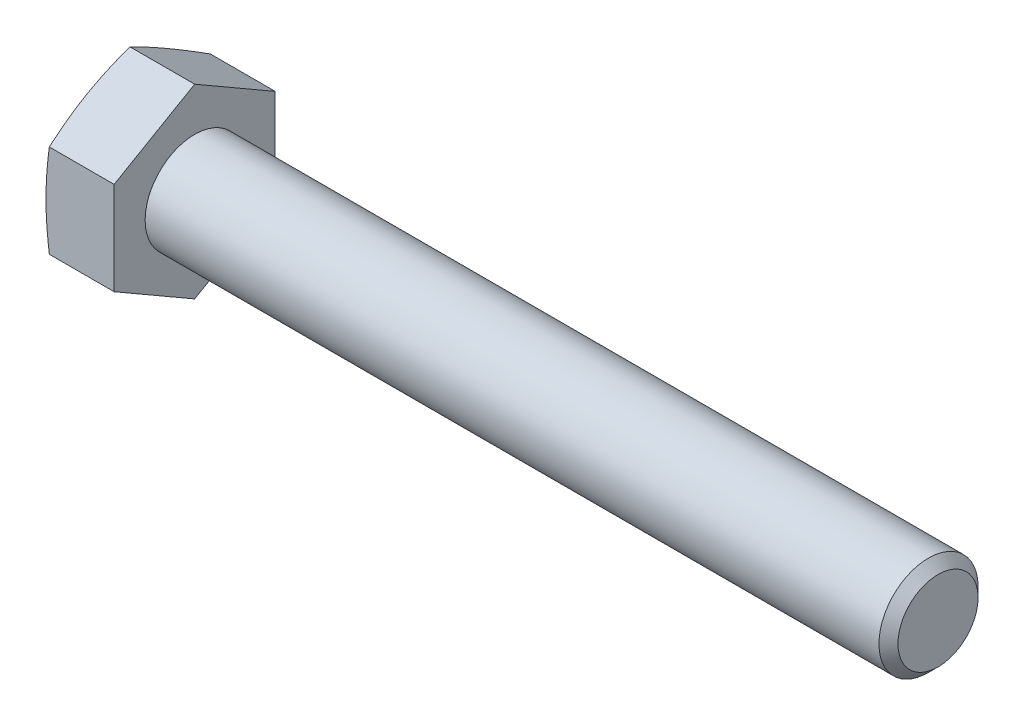
ISO-10303-21;
HEADER;
FILE_DESCRIPTION(('STEP AP214'),'2;1');
FILE_NAME('part.step','',(''),(''),'','','');
FILE_SCHEMA(('AUTOMOTIVE_DESIGN { 1 0 10303 214 1 1 1 1 }'));
ENDSEC;
DATA;
#1=APPLICATION_CONTEXT('core data for automotive mechanical design processes');
#2=APPLICATION_PROTOCOL_DEFINITION('international standard','automotive_design',2000,#1);
#3=PRODUCT_CONTEXT('',#1,'mechanical');
#4=PRODUCT('Part','Part','',(#3));
#5=PRODUCT_RELATED_PRODUCT_CATEGORY('part','',(#4));
#6=PRODUCT_DEFINITION_FORMATION('','',#4);
#7=PRODUCT_DEFINITION_CONTEXT('part definition',#1,'design');
#8=PRODUCT_DEFINITION('design','',#6,#7);
#9=PRODUCT_DEFINITION_SHAPE('','',#8);
#10=(LENGTH_UNIT() NAMED_UNIT(*) SI_UNIT(.MILLI.,.METRE.));
#11=(NAMED_UNIT(*) PLANE_ANGLE_UNIT() SI_UNIT($,.RADIAN.));
#12=(NAMED_UNIT(*) SI_UNIT($,.STERADIAN.) SOLID_ANGLE_UNIT());
#13=UNCERTAINTY_MEASURE_WITH_UNIT(LENGTH_MEASURE(1.E-05),#10,'distance_accuracy_value','');
#14=(GEOMETRIC_REPRESENTATION_CONTEXT(3) GLOBAL_UNCERTAINTY_ASSIGNED_CONTEXT((#13)) GLOBAL_UNIT_ASSIGNED_CONTEXT((#10,
#11,#12)) REPRESENTATION_CONTEXT('',''));
#15=CARTESIAN_POINT('',(0.,0.,0.));
#16=DIRECTION('',(0.,0.,1.));
#17=DIRECTION('',(1.,0.,0.));
#18=AXIS2_PLACEMENT_3D('',#15,#16,#17);
#19=CARTESIAN_POINT('',(-5.5,0.,0.));
#20=DIRECTION('',(1.,0.,0.));
#21=DIRECTION('',(0.,0.,-1.));
#22=AXIS2_PLACEMENT_3D('',#19,#20,#21);
#23=PLANE('',#22);
#24=CARTESIAN_POINT('',(-5.49999999998363,0.,0.));
#25=DIRECTION('',(1.,0.,0.));
#26=DIRECTION('',(0.,0.,-1.));
#27=AXIS2_PLACEMENT_3D('',#24,#25,#26);
#28=CIRCLE('',#27,6.50000000001683);
#29=CARTESIAN_POINT('',(-5.49999999998588,0.,-6.50000000000841));
#30=VERTEX_POINT('',#29);
#31=CARTESIAN_POINT('',(-5.49999999998588,5.62916512460615,-3.25000000000419));
#32=VERTEX_POINT('',#31);
#33=EDGE_CURVE('E92',#30,#32,#28,.T.);
#34=ORIENTED_EDGE('',*,*,#33,.F.);
#35=CARTESIAN_POINT('',(-5.49999999998363,0.,0.));
#36=DIRECTION('',(1.,0.,0.));
#37=DIRECTION('',(0.,0.,-1.));
#38=AXIS2_PLACEMENT_3D('',#35,#36,#37);
#39=CIRCLE('',#38,6.50000000001683);
#40=CARTESIAN_POINT('',(-5.49999999998588,-5.62916512460613,-3.25000000000421));
#41=VERTEX_POINT('',#40);
#42=EDGE_CURVE('E20',#41,#30,#39,.T.);
#43=ORIENTED_EDGE('',*,*,#42,.F.);
#44=CARTESIAN_POINT('',(-5.49999999998363,0.,0.));
#45=DIRECTION('',(1.,0.,0.));
#46=DIRECTION('',(0.,0.,-1.));
#47=AXIS2_PLACEMENT_3D('',#44,#45,#46);
#48=CIRCLE('',#47,6.50000000001683);
#49=CARTESIAN_POINT('',(-5.49999999998588,-5.62916512460613,3.25000000000421));
#50=VERTEX_POINT('',#49);
#51=EDGE_CURVE('E89',#50,#41,#48,.T.);
#52=ORIENTED_EDGE('',*,*,#51,.F.);
#53=CARTESIAN_POINT('',(-5.49999999998363,0.,0.));
#54=DIRECTION('',(1.,0.,0.));
#55=DIRECTION('',(0.,0.,-1.));
#56=AXIS2_PLACEMENT_3D('',#53,#54,#55);
#57=CIRCLE('',#56,6.50000000001683);
#58=CARTESIAN_POINT('',(-5.49999999998588,0.,6.50000000000841));
#59=VERTEX_POINT('',#58);
#60=EDGE_CURVE('E115',#59,#50,#57,.T.);
#61=ORIENTED_EDGE('',*,*,#60,.F.);
#62=CARTESIAN_POINT('',(-5.49999999998363,0.,0.));
#63=DIRECTION('',(1.,0.,0.));
#64=DIRECTION('',(0.,0.,-1.));
#65=AXIS2_PLACEMENT_3D('',#62,#63,#64);
#66=CIRCLE('',#65,6.50000000001683);
#67=CARTESIAN_POINT('',(-5.49999999998588,5.62916512460615,3.25000000000418));
#68=VERTEX_POINT('',#67);
#69=EDGE_CURVE('E355',#68,#59,#66,.T.);
#70=ORIENTED_EDGE('',*,*,#69,.F.);
#71=CARTESIAN_POINT('',(-5.49999999998363,0.,0.));
#72=DIRECTION('',(1.,0.,0.));
#73=DIRECTION('',(0.,0.,-1.));
#74=AXIS2_PLACEMENT_3D('',#71,#72,#73);
#75=CIRCLE('',#74,6.50000000001683);
#76=EDGE_CURVE('E358',#32,#68,#75,.T.);
#77=ORIENTED_EDGE('',*,*,#76,.F.);
#78=EDGE_LOOP('',(#34,#43,#52,#61,#70,#77));
#79=FACE_BOUND('',#78,.T.);
#80=ADVANCED_FACE('F17',(#79),#23,.F.);
#81=CARTESIAN_POINT('',(-5.22894612839764,0.,0.));
#82=DIRECTION('',(1.,0.,0.));
#83=DIRECTION('',(0.,0.,-1.));
#84=AXIS2_PLACEMENT_3D('',#81,#82,#83);
#85=CONICAL_SURFACE('',#84,7.51158682044206,1.30899693901504);
#86=CARTESIAN_POINT('',(-5.49999999998814,0.,-6.5));
#87=CARTESIAN_POINT('',(-5.50000713978379,-0.157002105596299,-6.5));
#88=CARTESIAN_POINT('',(-5.4984751302546,-0.313999789626533,-6.5));
#89=CARTESIAN_POINT('',(-5.49239322575447,-0.627931829436982,-6.5));
#90=CARTESIAN_POINT('',(-5.48784342787752,-0.784866187092113,-6.5));
#91=CARTESIAN_POINT('',(-5.46977187497293,-1.25514181892625,-6.5));
#92=CARTESIAN_POINT('',(-5.45182768773492,-1.56832203806163,-6.5));
#93=CARTESIAN_POINT('',(-5.40524314283542,-2.19378211713765,-6.5));
#94=CARTESIAN_POINT('',(-5.3766053075313,-2.50606217191358,-6.5));
#95=CARTESIAN_POINT('',(-5.31011748578564,-3.13000727514166,-6.5));
#96=CARTESIAN_POINT('',(-5.27225704270841,-3.44167121780765,-6.5));
#97=CARTESIAN_POINT('',(-5.2305627518808,-3.75277674973374,-6.5));
#98=B_SPLINE_CURVE_WITH_KNOTS('',3,(#86,#87,#88,#89,#90,#91,#92,#93,#94,#95,#96,#97),
.UNSPECIFIED.,.F.,.F.,(4,2,2,2,2,4),(0.,0.47099046628288,0.941965779704949,1.88281797607341,
2.82344838957416,3.76515029917301),.UNSPECIFIED.);
#99=CARTESIAN_POINT('',(-5.23056275188088,-3.75277674973315,-6.5));
#100=VERTEX_POINT('',#99);
#101=EDGE_CURVE('E100',#30,#100,#98,.T.);
#102=ORIENTED_EDGE('',*,*,#101,.T.);
#103=CARTESIAN_POINT('',(-5.2305627518808,-3.75277674973198,-6.50000000000102));
#104=CARTESIAN_POINT('',(-5.27225704270841,-3.90832951569502,-6.23057470609516));
#105=CARTESIAN_POINT('',(-5.31011748578564,-4.06416148702801,-5.96066581430279));
#106=CARTESIAN_POINT('',(-5.3766053075313,-4.37613403864205,-5.42031350434037));
#107=CARTESIAN_POINT('',(-5.40524314283542,-4.53227406603002,-5.14987104380922));
#108=CARTESIAN_POINT('',(-5.45182768773492,-4.84500410556803,-4.60820672627636));
#109=CARTESIAN_POINT('',(-5.46977187497293,-5.00159421513572,-4.33698470054235));
#110=CARTESIAN_POINT('',(-5.48784342787752,-5.23673203105279,-3.92971405659321));
#111=CARTESIAN_POINT('',(-5.49239322575447,-5.31519920988035,-3.79380491613727));
#112=CARTESIAN_POINT('',(-5.4984751302546,-5.47216522978558,-3.52193179459955));
#113=CARTESIAN_POINT('',(-5.50000713978379,-5.55066407180069,-3.38596781189405));
#114=CARTESIAN_POINT('',(-5.49999999998814,-5.62916512459884,-3.25000000000001));
#115=B_SPLINE_CURVE_WITH_KNOTS('',3,(#103,#104,#105,#106,#107,#108,#109,#110,#111,#112,#113,
#114),.UNSPECIFIED.,.F.,.F.,(4,2,2,2,2,4),(0.,0.941701909598858,1.8823323230996,
2.82318451946807,3.29415983289013,3.76515029917301),.UNSPECIFIED.);
#116=EDGE_CURVE('E98',#100,#41,#115,.T.);
#117=ORIENTED_EDGE('',*,*,#116,.T.);
#118=ORIENTED_EDGE('',*,*,#42,.T.);
#119=EDGE_LOOP('',(#102,#117,#118));
#120=FACE_BOUND('',#119,.T.);
#121=ADVANCED_FACE('F99',(#120),#85,.T.);
#122=CARTESIAN_POINT('',(-5.22894612839764,0.,0.));
#123=DIRECTION('',(1.,0.,0.));
#124=DIRECTION('',(0.,0.,-1.));
#125=AXIS2_PLACEMENT_3D('',#122,#123,#124);
#126=CONICAL_SURFACE('',#125,7.51158682044206,1.30899693901504);
#127=CARTESIAN_POINT('',(-5.49999999998814,-5.62916512459884,-3.25000000000001));
#128=CARTESIAN_POINT('',(-5.50000713978379,-5.70766617739699,-3.11403218810596));
#129=CARTESIAN_POINT('',(-5.4984751302546,-5.78616501941211,-2.97806820540046));
#130=CARTESIAN_POINT('',(-5.49239322575447,-5.94313103931734,-2.70619508386274));
#131=CARTESIAN_POINT('',(-5.48784342787752,-6.0215982181449,-2.5702859434068));
#132=CARTESIAN_POINT('',(-5.46977187497293,-6.25673603406197,-2.16301529945766));
#133=CARTESIAN_POINT('',(-5.45182768773492,-6.41332614362966,-1.89179327372364));
#134=CARTESIAN_POINT('',(-5.40524314283542,-6.72605618316767,-1.35012895619078));
#135=CARTESIAN_POINT('',(-5.3766053075313,-6.88219621055564,-1.07968649565962));
#136=CARTESIAN_POINT('',(-5.31011748578564,-7.19416876216969,-0.539334185697196));
#137=CARTESIAN_POINT('',(-5.27225704270841,-7.35000073350268,-0.269425293904831));
#138=CARTESIAN_POINT('',(-5.2305627518808,-7.50555349946573,1.03384319878969E-12));
#139=B_SPLINE_CURVE_WITH_KNOTS('',3,(#127,#128,#129,#130,#131,#132,#133,#134,#135,#136,#137,
#138),.UNSPECIFIED.,.F.,.F.,(4,2,2,2,2,4),(0.,0.470990466282884,0.941965779704958,
1.88281797607343,2.82344838957418,3.76515029917305),.UNSPECIFIED.);
#140=CARTESIAN_POINT('',(-5.23056275188088,-7.50555349946543,5.18363870005202E-13));
#141=VERTEX_POINT('',#140);
#142=EDGE_CURVE('E106',#41,#141,#139,.T.);
#143=ORIENTED_EDGE('',*,*,#142,.T.);
#144=CARTESIAN_POINT('',(-5.2305627518808,-7.50555349946571,-9.97501966197395E-13));
#145=CARTESIAN_POINT('',(-5.27225704270841,-7.35000073350267,0.269425293904866));
#146=CARTESIAN_POINT('',(-5.31011748578564,-7.19416876216968,0.539334185697226));
#147=CARTESIAN_POINT('',(-5.3766053075313,-6.88219621055564,1.07968649565964));
#148=CARTESIAN_POINT('',(-5.40524314283542,-6.72605618316767,1.3501289561908));
#149=CARTESIAN_POINT('',(-5.45182768773492,-6.41332614362966,1.89179327372365));
#150=CARTESIAN_POINT('',(-5.46977187497293,-6.25673603406197,2.16301529945767));
#151=CARTESIAN_POINT('',(-5.48784342787752,-6.02159821814491,2.57028594340681));
#152=CARTESIAN_POINT('',(-5.49239322575447,-5.94313103931734,2.70619508386274));
#153=CARTESIAN_POINT('',(-5.4984751302546,-5.78616501941212,2.97806820540046));
#154=CARTESIAN_POINT('',(-5.50000713978379,-5.707666177397,3.11403218810596));
#155=CARTESIAN_POINT('',(-5.49999999998814,-5.62916512459885,3.25));
#156=B_SPLINE_CURVE_WITH_KNOTS('',3,(#144,#145,#146,#147,#148,#149,#150,#151,#152,#153,#154,
#155),.UNSPECIFIED.,.F.,.F.,(4,2,2,2,2,4),(0.,0.941701909598855,1.88233232309959,
2.82318451946806,3.29415983289012,3.765150299173),.UNSPECIFIED.);
#157=EDGE_CURVE('E112',#141,#50,#156,.T.);
#158=ORIENTED_EDGE('',*,*,#157,.T.);
#159=ORIENTED_EDGE('',*,*,#51,.T.);
#160=EDGE_LOOP('',(#143,#158,#159));
#161=FACE_BOUND('',#160,.T.);
#162=ADVANCED_FACE('F109',(#161),#126,.T.);
#163=CARTESIAN_POINT('',(-5.22894612839764,0.,0.));
#164=DIRECTION('',(1.,0.,0.));
#165=DIRECTION('',(0.,0.,-1.));
#166=AXIS2_PLACEMENT_3D('',#163,#164,#165);
#167=CONICAL_SURFACE('',#166,7.51158682044206,1.30899693901504);
#168=CARTESIAN_POINT('',(-5.49999999998814,-5.62916512459885,3.25));
#169=CARTESIAN_POINT('',(-5.50000713978379,-5.5506640718007,3.38596781189405));
#170=CARTESIAN_POINT('',(-5.4984751302546,-5.47216522978558,3.52193179459955));
#171=CARTESIAN_POINT('',(-5.49239322575447,-5.31519920988036,3.79380491613727));
#172=CARTESIAN_POINT('',(-5.48784342787752,-5.23673203105279,3.92971405659321));
#173=CARTESIAN_POINT('',(-5.46977187497293,-5.00159421513572,4.33698470054235));
#174=CARTESIAN_POINT('',(-5.45182768773491,-4.84500410556803,4.60820672627637));
#175=CARTESIAN_POINT('',(-5.40524314283541,-4.53227406603002,5.14987104380922));
#176=CARTESIAN_POINT('',(-5.37660530753129,-4.37613403864205,5.42031350434038));
#177=CARTESIAN_POINT('',(-5.31011748578564,-4.06416148702801,5.9606658143028));
#178=CARTESIAN_POINT('',(-5.2722570427084,-3.90832951569502,6.23057470609517));
#179=CARTESIAN_POINT('',(-5.2305627518808,-3.75277674973198,6.50000000000103));
#180=B_SPLINE_CURVE_WITH_KNOTS('',3,(#168,#169,#170,#171,#172,#173,#174,#175,#176,#177,#178,
#179),.UNSPECIFIED.,.F.,.F.,(4,2,2,2,2,4),(0.,0.470990466282883,0.941965779704954,
1.88281797607342,2.82344838957417,3.76515029917303),.UNSPECIFIED.);
#181=CARTESIAN_POINT('',(-5.23056275188088,-3.75277674973227,6.50000000000052));
#182=VERTEX_POINT('',#181);
#183=EDGE_CURVE('E318',#50,#182,#180,.T.);
#184=ORIENTED_EDGE('',*,*,#183,.T.);
#185=CARTESIAN_POINT('',(-5.2305627518808,-3.75277674973372,6.5));
#186=CARTESIAN_POINT('',(-5.27225704270841,-3.44167121780764,6.5));
#187=CARTESIAN_POINT('',(-5.31011748578564,-3.13000727514165,6.5));
#188=CARTESIAN_POINT('',(-5.3766053075313,-2.50606217191357,6.5));
#189=CARTESIAN_POINT('',(-5.40524314283542,-2.19378211713764,6.5));
#190=CARTESIAN_POINT('',(-5.45182768773492,-1.56832203806162,6.5));
#191=CARTESIAN_POINT('',(-5.46977187497293,-1.25514181892624,6.5));
#192=CARTESIAN_POINT('',(-5.48784342787752,-0.784866187092105,6.5));
#193=CARTESIAN_POINT('',(-5.49239322575447,-0.627931829436974,6.5));
#194=CARTESIAN_POINT('',(-5.4984751302546,-0.313999789626526,6.5));
#195=CARTESIAN_POINT('',(-5.50000713978379,-0.157002105596293,6.5));
#196=CARTESIAN_POINT('',(-5.49999999998814,0.,6.5));
#197=B_SPLINE_CURVE_WITH_KNOTS('',3,(#185,#186,#187,#188,#189,#190,#191,#192,#193,#194,#195,
#196),.UNSPECIFIED.,.F.,.F.,(4,2,2,2,2,4),(0.,0.941701909598857,1.8823323230996,
2.82318451946806,3.29415983289013,3.76515029917301),.UNSPECIFIED.);
#198=EDGE_CURVE('E317',#182,#59,#197,.T.);
#199=ORIENTED_EDGE('',*,*,#198,.T.);
#200=ORIENTED_EDGE('',*,*,#60,.T.);
#201=EDGE_LOOP('',(#184,#199,#200));
#202=FACE_BOUND('',#201,.T.);
#203=ADVANCED_FACE('F150',(#202),#167,.T.);
#204=CARTESIAN_POINT('',(-5.22894612839764,0.,0.));
#205=DIRECTION('',(1.,0.,0.));
#206=DIRECTION('',(0.,0.,-1.));
#207=AXIS2_PLACEMENT_3D('',#204,#205,#206);
#208=CONICAL_SURFACE('',#207,7.51158682044206,1.30899693901504);
#209=CARTESIAN_POINT('',(-5.2305627518808,3.75277674973198,6.50000000000101));
#210=CARTESIAN_POINT('',(-5.27225704270841,3.90832951569503,6.23057470609514));
#211=CARTESIAN_POINT('',(-5.31011748578564,4.06416148702802,5.96066581430278));
#212=CARTESIAN_POINT('',(-5.3766053075313,4.37613403864206,5.42031350434036));
#213=CARTESIAN_POINT('',(-5.40524314283542,4.53227406603003,5.1498710438092));
#214=CARTESIAN_POINT('',(-5.45182768773492,4.84500410556804,4.60820672627634));
#215=CARTESIAN_POINT('',(-5.46977187497293,5.00159421513573,4.33698470054232));
#216=CARTESIAN_POINT('',(-5.48784342787752,5.2367320310528,3.92971405659318));
#217=CARTESIAN_POINT('',(-5.49239322575447,5.31519920988037,3.79380491613724));
#218=CARTESIAN_POINT('',(-5.4984751302546,5.47216522978559,3.52193179459953));
#219=CARTESIAN_POINT('',(-5.50000713978379,5.55066407180071,3.38596781189402));
#220=CARTESIAN_POINT('',(-5.49999999998814,5.62916512459886,3.24999999999998));
#221=B_SPLINE_CURVE_WITH_KNOTS('',3,(#209,#210,#211,#212,#213,#214,#215,#216,#217,#218,#219,
#220),.UNSPECIFIED.,.F.,.F.,(4,2,2,2,2,4),(0.,0.941701909598863,1.88233232309961,
2.82318451946808,3.29415983289015,3.76515029917304),.UNSPECIFIED.);
#222=CARTESIAN_POINT('',(-5.23056275188088,3.75277674973314,6.5));
#223=VERTEX_POINT('',#222);
#224=EDGE_CURVE('E223',#223,#68,#221,.T.);
#225=ORIENTED_EDGE('',*,*,#224,.T.);
#226=ORIENTED_EDGE('',*,*,#69,.T.);
#227=CARTESIAN_POINT('',(-5.49999999998814,0.,6.5));
#228=CARTESIAN_POINT('',(-5.50000713978379,0.157002105596304,6.5));
#229=CARTESIAN_POINT('',(-5.4984751302546,0.313999789626537,6.5));
#230=CARTESIAN_POINT('',(-5.49239322575447,0.627931829436985,6.5));
#231=CARTESIAN_POINT('',(-5.48784342787752,0.784866187092114,6.5));
#232=CARTESIAN_POINT('',(-5.46977187497293,1.25514181892625,6.5));
#233=CARTESIAN_POINT('',(-5.45182768773492,1.56832203806163,6.5));
#234=CARTESIAN_POINT('',(-5.40524314283542,2.19378211713764,6.5));
#235=CARTESIAN_POINT('',(-5.3766053075313,2.50606217191358,6.5));
#236=CARTESIAN_POINT('',(-5.31011748578564,3.13000727514165,6.5));
#237=CARTESIAN_POINT('',(-5.27225704270841,3.44167121780764,6.5));
#238=CARTESIAN_POINT('',(-5.2305627518808,3.75277674973372,6.5));
#239=B_SPLINE_CURVE_WITH_KNOTS('',3,(#227,#228,#229,#230,#231,#232,#233,#234,#235,#236,#237,
#238),.UNSPECIFIED.,.F.,.F.,(4,2,2,2,2,4),(0.,0.470990466282877,0.941965779704944,
1.8828179760734,2.82344838957414,3.76515029917299),.UNSPECIFIED.);
#240=EDGE_CURVE('E232',#59,#223,#239,.T.);
#241=ORIENTED_EDGE('',*,*,#240,.T.);
#242=EDGE_LOOP('',(#225,#226,#241));
#243=FACE_BOUND('',#242,.T.);
#244=ADVANCED_FACE('F238',(#243),#208,.T.);
#245=CARTESIAN_POINT('',(-5.22894612839764,0.,0.));
#246=DIRECTION('',(1.,0.,0.));
#247=DIRECTION('',(0.,0.,-1.));
#248=AXIS2_PLACEMENT_3D('',#245,#246,#247);
#249=CONICAL_SURFACE('',#248,7.51158682044206,1.30899693901504);
#250=ORIENTED_EDGE('',*,*,#76,.T.);
#251=CARTESIAN_POINT('',(-5.49999999998814,5.62916512459886,3.24999999999998));
#252=CARTESIAN_POINT('',(-5.50000713978379,5.70766617739701,3.11403218810594));
#253=CARTESIAN_POINT('',(-5.4984751302546,5.78616501941212,2.97806820540043));
#254=CARTESIAN_POINT('',(-5.49239322575447,5.94313103931735,2.70619508386272));
#255=CARTESIAN_POINT('',(-5.48784342787752,6.02159821814491,2.57028594340679));
#256=CARTESIAN_POINT('',(-5.46977187497293,6.25673603406198,2.16301529945765));
#257=CARTESIAN_POINT('',(-5.45182768773492,6.41332614362967,1.89179327372364));
#258=CARTESIAN_POINT('',(-5.40524314283542,6.72605618316767,1.35012895619079));
#259=CARTESIAN_POINT('',(-5.3766053075313,6.88219621055564,1.07968649565963));
#260=CARTESIAN_POINT('',(-5.31011748578564,7.19416876216967,0.539334185697221));
#261=CARTESIAN_POINT('',(-5.27225704270841,7.35000073350266,0.269425293904863));
#262=CARTESIAN_POINT('',(-5.23056275188081,7.50555349946571,-9.97859211821794E-13));
#263=B_SPLINE_CURVE_WITH_KNOTS('',3,(#251,#252,#253,#254,#255,#256,#257,#258,#259,#260,#261,
#262),.UNSPECIFIED.,.F.,.F.,(4,2,2,2,2,4),(0.,0.470990466282875,0.941965779704939,
1.88281797607339,2.82344838957412,3.76515029917297),.UNSPECIFIED.);
#264=CARTESIAN_POINT('',(-5.23056275188088,7.50555349946542,-5.00913206281087E-13));
#265=VERTEX_POINT('',#264);
#266=EDGE_CURVE('E217',#68,#265,#263,.T.);
#267=ORIENTED_EDGE('',*,*,#266,.T.);
#268=CARTESIAN_POINT('',(-5.23056275188081,7.50555349946571,9.87422566978166E-13));
#269=CARTESIAN_POINT('',(-5.27225704270841,7.35000073350266,-0.269425293904872));
#270=CARTESIAN_POINT('',(-5.31011748578564,7.19416876216967,-0.539334185697231));
#271=CARTESIAN_POINT('',(-5.3766053075313,6.88219621055564,-1.07968649565964));
#272=CARTESIAN_POINT('',(-5.40524314283542,6.72605618316767,-1.3501289561908));
#273=CARTESIAN_POINT('',(-5.45182768773492,6.41332614362967,-1.89179327372365));
#274=CARTESIAN_POINT('',(-5.46977187497293,6.25673603406198,-2.16301529945766));
#275=CARTESIAN_POINT('',(-5.48784342787752,6.02159821814491,-2.57028594340679));
#276=CARTESIAN_POINT('',(-5.49239322575447,5.94313103931735,-2.70619508386273));
#277=CARTESIAN_POINT('',(-5.4984751302546,5.78616501941213,-2.97806820540044));
#278=CARTESIAN_POINT('',(-5.50000713978379,5.70766617739701,-3.11403218810594));
#279=CARTESIAN_POINT('',(-5.49999999998814,5.62916512459886,-3.24999999999998));
#280=B_SPLINE_CURVE_WITH_KNOTS('',3,(#268,#269,#270,#271,#272,#273,#274,#275,#276,#277,#278,
#279),.UNSPECIFIED.,.F.,.F.,(4,2,2,2,2,4),(0.,0.941701909598847,1.88233232309958,
2.82318451946803,3.29415983289009,3.76515029917297),.UNSPECIFIED.);
#281=EDGE_CURVE('E193',#265,#32,#280,.T.);
#282=ORIENTED_EDGE('',*,*,#281,.T.);
#283=EDGE_LOOP('',(#250,#267,#282));
#284=FACE_BOUND('',#283,.T.);
#285=ADVANCED_FACE('F179',(#284),#249,.T.);
#286=CARTESIAN_POINT('',(-5.22894612839764,0.,0.));
#287=DIRECTION('',(1.,0.,0.));
#288=DIRECTION('',(0.,0.,-1.));
#289=AXIS2_PLACEMENT_3D('',#286,#287,#288);
#290=CONICAL_SURFACE('',#289,7.51158682044206,1.30899693901504);
#291=CARTESIAN_POINT('',(-5.49999999998814,5.62916512459886,-3.24999999999998));
#292=CARTESIAN_POINT('',(-5.50000713978379,5.55066407180071,-3.38596781189403));
#293=CARTESIAN_POINT('',(-5.4984751302546,5.4721652297856,-3.52193179459953));
#294=CARTESIAN_POINT('',(-5.49239322575447,5.31519920988037,-3.79380491613725));
#295=CARTESIAN_POINT('',(-5.48784342787752,5.2367320310528,-3.92971405659319));
#296=CARTESIAN_POINT('',(-5.46977187497293,5.00159421513573,-4.33698470054233));
#297=CARTESIAN_POINT('',(-5.45182768773492,4.84500410556804,-4.60820672627635));
#298=CARTESIAN_POINT('',(-5.40524314283542,4.53227406603003,-5.14987104380921));
#299=CARTESIAN_POINT('',(-5.3766053075313,4.37613403864206,-5.42031350434037));
#300=CARTESIAN_POINT('',(-5.31011748578564,4.06416148702802,-5.96066581430279));
#301=CARTESIAN_POINT('',(-5.27225704270841,3.90832951569503,-6.23057470609515));
#302=CARTESIAN_POINT('',(-5.2305627518808,3.75277674973198,-6.50000000000102));
#303=B_SPLINE_CURVE_WITH_KNOTS('',3,(#291,#292,#293,#294,#295,#296,#297,#298,#299,#300,#301,
#302),.UNSPECIFIED.,.F.,.F.,(4,2,2,2,2,4),(0.,0.470990466282883,0.941965779704955,
1.88281797607343,2.82344838957418,3.76515029917304),.UNSPECIFIED.);
#304=CARTESIAN_POINT('',(-5.2305627518808,3.75277674973286,-6.50000000000051));
#305=VERTEX_POINT('',#304);
#306=EDGE_CURVE('E184',#32,#305,#303,.T.);
#307=ORIENTED_EDGE('',*,*,#306,.T.);
#308=CARTESIAN_POINT('',(-5.2305627518808,3.75277674973375,-6.5));
#309=CARTESIAN_POINT('',(-5.27225704270841,3.44167121780766,-6.5));
#310=CARTESIAN_POINT('',(-5.31011748578564,3.13000727514167,-6.5));
#311=CARTESIAN_POINT('',(-5.37660530753129,2.50606217191359,-6.5));
#312=CARTESIAN_POINT('',(-5.40524314283541,2.19378211713765,-6.5));
#313=CARTESIAN_POINT('',(-5.45182768773492,1.56832203806163,-6.5));
#314=CARTESIAN_POINT('',(-5.46977187497293,1.25514181892625,-6.5));
#315=CARTESIAN_POINT('',(-5.48784342787752,0.784866187092114,-6.5));
#316=CARTESIAN_POINT('',(-5.49239322575447,0.627931829436983,-6.5));
#317=CARTESIAN_POINT('',(-5.4984751302546,0.313999789626533,-6.5));
#318=CARTESIAN_POINT('',(-5.50000713978379,0.157002105596299,-6.5));
#319=CARTESIAN_POINT('',(-5.49999999998814,0.,-6.5));
#320=B_SPLINE_CURVE_WITH_KNOTS('',3,(#308,#309,#310,#311,#312,#313,#314,#315,#316,#317,#318,
#319),.UNSPECIFIED.,.F.,.F.,(4,2,2,2,2,4),(0.,0.941701909598861,1.8823323230996,
2.82318451946807,3.29415983289014,3.76515029917302),.UNSPECIFIED.);
#321=EDGE_CURVE('E163',#305,#30,#320,.T.);
#322=ORIENTED_EDGE('',*,*,#321,.T.);
#323=ORIENTED_EDGE('',*,*,#33,.T.);
#324=EDGE_LOOP('',(#307,#322,#323));
#325=FACE_BOUND('',#324,.T.);
#326=ADVANCED_FACE('F173',(#325),#290,.T.);
#327=CARTESIAN_POINT('',(0.,-3.75277674973257,-6.5));
#328=DIRECTION('',(0.,0.,1.));
#329=DIRECTION('',(1.,0.,0.));
#330=AXIS2_PLACEMENT_3D('',#327,#328,#329);
#331=PLANE('',#330);
#332=DIRECTION('',(0.,1.,0.));
#333=VECTOR('',#332,1.);
#334=CARTESIAN_POINT('',(0.,7.8,-6.5));
#335=LINE('',#334,#333);
#336=CARTESIAN_POINT('',(0.,3.75277674973257,-6.5));
#337=VERTEX_POINT('',#336);
#338=CARTESIAN_POINT('',(0.,-3.75277674973256,-6.5));
#339=VERTEX_POINT('',#338);
#340=EDGE_CURVE('E290',#337,#339,#335,.F.);
#341=ORIENTED_EDGE('',*,*,#340,.T.);
#342=DIRECTION('',(1.,0.,0.));
#343=VECTOR('',#342,1.);
#344=CARTESIAN_POINT('',(0.,-3.75277674973256,-6.5));
#345=LINE('',#344,#343);
#346=EDGE_CURVE('E120',#339,#100,#345,.F.);
#347=ORIENTED_EDGE('',*,*,#346,.T.);
#348=ORIENTED_EDGE('',*,*,#101,.F.);
#349=ORIENTED_EDGE('',*,*,#321,.F.);
#350=DIRECTION('',(1.,0.,0.));
#351=VECTOR('',#350,1.);
#352=CARTESIAN_POINT('',(0.,3.75277674973257,-6.5));
#353=LINE('',#352,#351);
#354=EDGE_CURVE('E192',#305,#337,#353,.T.);
#355=ORIENTED_EDGE('',*,*,#354,.T.);
#356=EDGE_LOOP('',(#341,#347,#348,#349,#355));
#357=FACE_BOUND('',#356,.T.);
#358=ADVANCED_FACE('F170',(#357),#331,.F.);
#359=CARTESIAN_POINT('',(0.,-7.50555349946513,0.));
#360=DIRECTION('',(0.,0.866025403784439,0.5));
#361=DIRECTION('',(0.,-0.5,0.866025403784439));
#362=AXIS2_PLACEMENT_3D('',#359,#360,#361);
#363=PLANE('',#362);
#364=DIRECTION('',(0.,-0.5,0.866025403784439));
#365=VECTOR('',#364,1.);
#366=CARTESIAN_POINT('',(0.,-3.75277674973256,-6.5));
#367=LINE('',#366,#365);
#368=CARTESIAN_POINT('',(0.,-7.50555349946513,0.));
#369=VERTEX_POINT('',#368);
#370=EDGE_CURVE('E292',#339,#369,#367,.T.);
#371=ORIENTED_EDGE('',*,*,#370,.T.);
#372=DIRECTION('',(1.,0.,0.));
#373=VECTOR('',#372,1.);
#374=CARTESIAN_POINT('',(0.,-7.50555349946513,0.));
#375=LINE('',#374,#373);
#376=EDGE_CURVE('E118',#369,#141,#375,.F.);
#377=ORIENTED_EDGE('',*,*,#376,.T.);
#378=ORIENTED_EDGE('',*,*,#142,.F.);
#379=ORIENTED_EDGE('',*,*,#116,.F.);
#380=ORIENTED_EDGE('',*,*,#346,.F.);
#381=EDGE_LOOP('',(#371,#377,#378,#379,#380));
#382=FACE_BOUND('',#381,.T.);
#383=ADVANCED_FACE('F116',(#382),#363,.F.);
#384=CARTESIAN_POINT('',(0.,-3.75277674973257,6.5));
#385=DIRECTION('',(0.,0.866025403784439,-0.5));
#386=DIRECTION('',(0.,0.5,0.866025403784439));
#387=AXIS2_PLACEMENT_3D('',#384,#385,#386);
#388=PLANE('',#387);
#389=DIRECTION('',(0.,0.499999999999999,0.866025403784439));
#390=VECTOR('',#389,1.);
#391=CARTESIAN_POINT('',(0.,-7.50555349946513,0.));
#392=LINE('',#391,#390);
#393=CARTESIAN_POINT('',(0.,-3.75277674973257,6.5));
#394=VERTEX_POINT('',#393);
#395=EDGE_CURVE('E281',#369,#394,#392,.T.);
#396=ORIENTED_EDGE('',*,*,#395,.T.);
#397=DIRECTION('',(-1.,0.,0.));
#398=VECTOR('',#397,1.);
#399=CARTESIAN_POINT('',(0.,-3.75277674973257,6.5));
#400=LINE('',#399,#398);
#401=EDGE_CURVE('E231',#394,#182,#400,.T.);
#402=ORIENTED_EDGE('',*,*,#401,.T.);
#403=ORIENTED_EDGE('',*,*,#183,.F.);
#404=ORIENTED_EDGE('',*,*,#157,.F.);
#405=ORIENTED_EDGE('',*,*,#376,.F.);
#406=EDGE_LOOP('',(#396,#402,#403,#404,#405));
#407=FACE_BOUND('',#406,.T.);
#408=ADVANCED_FACE('F346',(#407),#388,.F.);
#409=CARTESIAN_POINT('',(0.,3.75277674973257,6.5));
#410=DIRECTION('',(0.,0.,-1.));
#411=DIRECTION('',(-1.,0.,0.));
#412=AXIS2_PLACEMENT_3D('',#409,#410,#411);
#413=PLANE('',#412);
#414=DIRECTION('',(0.,1.,0.));
#415=VECTOR('',#414,1.);
#416=CARTESIAN_POINT('',(0.,7.8,6.5));
#417=LINE('',#416,#415);
#418=CARTESIAN_POINT('',(0.,3.75277674973257,6.5));
#419=VERTEX_POINT('',#418);
#420=EDGE_CURVE('E271',#394,#419,#417,.T.);
#421=ORIENTED_EDGE('',*,*,#420,.T.);
#422=DIRECTION('',(1.,0.,0.));
#423=VECTOR('',#422,1.);
#424=CARTESIAN_POINT('',(0.,3.75277674973256,6.5));
#425=LINE('',#424,#423);
#426=EDGE_CURVE('E333',#419,#223,#425,.F.);
#427=ORIENTED_EDGE('',*,*,#426,.T.);
#428=ORIENTED_EDGE('',*,*,#240,.F.);
#429=ORIENTED_EDGE('',*,*,#198,.F.);
#430=ORIENTED_EDGE('',*,*,#401,.F.);
#431=EDGE_LOOP('',(#421,#427,#428,#429,#430));
#432=FACE_BOUND('',#431,.T.);
#433=ADVANCED_FACE('F214',(#432),#413,.F.);
#434=CARTESIAN_POINT('',(0.,7.50555349946513,0.));
#435=DIRECTION('',(0.,-0.866025403784439,-0.5));
#436=DIRECTION('',(0.,0.5,-0.866025403784439));
#437=AXIS2_PLACEMENT_3D('',#434,#435,#436);
#438=PLANE('',#437);
#439=DIRECTION('',(0.,0.499999999999999,-0.866025403784439));
#440=VECTOR('',#439,1.);
#441=CARTESIAN_POINT('',(0.,3.75277674973257,6.5));
#442=LINE('',#441,#440);
#443=CARTESIAN_POINT('',(0.,7.50555349946513,0.));
#444=VERTEX_POINT('',#443);
#445=EDGE_CURVE('E36',#419,#444,#442,.T.);
#446=ORIENTED_EDGE('',*,*,#445,.T.);
#447=DIRECTION('',(1.,0.,0.));
#448=VECTOR('',#447,1.);
#449=CARTESIAN_POINT('',(0.,7.50555349946513,0.));
#450=LINE('',#449,#448);
#451=EDGE_CURVE('E293',#444,#265,#450,.F.);
#452=ORIENTED_EDGE('',*,*,#451,.T.);
#453=ORIENTED_EDGE('',*,*,#266,.F.);
#454=ORIENTED_EDGE('',*,*,#224,.F.);
#455=ORIENTED_EDGE('',*,*,#426,.F.);
#456=EDGE_LOOP('',(#446,#452,#453,#454,#455));
#457=FACE_BOUND('',#456,.T.);
#458=ADVANCED_FACE('F207',(#457),#438,.F.);
#459=CARTESIAN_POINT('',(0.,3.75277674973257,-6.5));
#460=DIRECTION('',(0.,-0.866025403784439,0.5));
#461=DIRECTION('',(0.,-0.5,-0.866025403784439));
#462=AXIS2_PLACEMENT_3D('',#459,#460,#461);
#463=PLANE('',#462);
#464=DIRECTION('',(0.,-0.499999999999999,-0.866025403784439));
#465=VECTOR('',#464,1.);
#466=CARTESIAN_POINT('',(0.,7.50555349946513,0.));
#467=LINE('',#466,#465);
#468=EDGE_CURVE('E274',#444,#337,#467,.T.);
#469=ORIENTED_EDGE('',*,*,#468,.T.);
#470=ORIENTED_EDGE('',*,*,#354,.F.);
#471=ORIENTED_EDGE('',*,*,#306,.F.);
#472=ORIENTED_EDGE('',*,*,#281,.F.);
#473=ORIENTED_EDGE('',*,*,#451,.F.);
#474=EDGE_LOOP('',(#469,#470,#471,#472,#473));
#475=FACE_BOUND('',#474,.T.);
#476=ADVANCED_FACE('F201',(#475),#463,.F.);
#477=CARTESIAN_POINT('',(60.,3.233,0.));
#478=DIRECTION('',(-1.,0.,0.));
#479=DIRECTION('',(0.,0.,1.));
#480=AXIS2_PLACEMENT_3D('',#477,#478,#479);
#481=PLANE('',#480);
#482=CARTESIAN_POINT('',(60.0000000000023,0.,0.));
#483=DIRECTION('',(-1.,0.,0.));
#484=DIRECTION('',(0.,0.,1.));
#485=AXIS2_PLACEMENT_3D('',#482,#483,#484);
#486=CIRCLE('',#485,3.23299999996607);
#487=CARTESIAN_POINT('',(60.0000000000023,0.,3.23299999996607));
#488=VERTEX_POINT('',#487);
#489=EDGE_CURVE('E194',#488,#488,#486,.T.);
#490=ORIENTED_EDGE('',*,*,#489,.F.);
#491=EDGE_LOOP('',(#490));
#492=FACE_BOUND('',#491,.T.);
#493=ADVANCED_FACE('F206',(#492),#481,.F.);
#494=CARTESIAN_POINT('',(0.,7.8,0.));
#495=DIRECTION('',(-1.,0.,0.));
#496=DIRECTION('',(0.,0.,1.));
#497=AXIS2_PLACEMENT_3D('',#494,#495,#496);
#498=PLANE('',#497);
#499=CARTESIAN_POINT('',(0.,0.,0.));
#500=DIRECTION('',(-1.,0.,0.));
#501=DIRECTION('',(0.,0.,1.));
#502=AXIS2_PLACEMENT_3D('',#499,#500,#501);
#503=CIRCLE('',#502,4.);
#504=CARTESIAN_POINT('',(0.,0.,4.));
#505=VERTEX_POINT('',#504);
#506=EDGE_CURVE('E27',#505,#505,#503,.F.);
#507=ORIENTED_EDGE('',*,*,#506,.F.);
#508=EDGE_LOOP('',(#507));
#509=FACE_BOUND('',#508,.T.);
#510=ORIENTED_EDGE('',*,*,#445,.F.);
#511=ORIENTED_EDGE('',*,*,#420,.F.);
#512=ORIENTED_EDGE('',*,*,#395,.F.);
#513=ORIENTED_EDGE('',*,*,#370,.F.);
#514=ORIENTED_EDGE('',*,*,#340,.F.);
#515=ORIENTED_EDGE('',*,*,#468,.F.);
#516=EDGE_LOOP('',(#510,#511,#512,#513,#514,#515));
#517=FACE_BOUND('',#516,.T.);
#518=ADVANCED_FACE('F256',(#509,#517),#498,.F.);
#519=CARTESIAN_POINT('',(59.2330000000061,0.,0.));
#520=DIRECTION('',(-1.,0.,0.));
#521=DIRECTION('',(0.,0.,1.));
#522=AXIS2_PLACEMENT_3D('',#519,#520,#521);
#523=CONICAL_SURFACE('',#522,3.99999999996226,0.785398163397448);
#524=CARTESIAN_POINT('',(59.233,0.,0.));
#525=DIRECTION('',(-1.,0.,0.));
#526=DIRECTION('',(0.,0.,1.));
#527=AXIS2_PLACEMENT_3D('',#524,#525,#526);
#528=CIRCLE('',#527,4.);
#529=CARTESIAN_POINT('',(59.233,0.,4.));
#530=VERTEX_POINT('',#529);
#531=EDGE_CURVE('E11',#530,#530,#528,.T.);
#532=ORIENTED_EDGE('',*,*,#531,.F.);
#533=EDGE_LOOP('',(#532));
#534=FACE_BOUND('',#533,.T.);
#535=ORIENTED_EDGE('',*,*,#489,.T.);
#536=EDGE_LOOP('',(#535));
#537=FACE_BOUND('',#536,.T.);
#538=ADVANCED_FACE('F251',(#534,#537),#523,.T.);
#539=CARTESIAN_POINT('',(60.,0.,0.));
#540=DIRECTION('',(-1.,0.,0.));
#541=DIRECTION('',(0.,0.,1.));
#542=AXIS2_PLACEMENT_3D('',#539,#540,#541);
#543=CYLINDRICAL_SURFACE('',#542,4.);
#544=ORIENTED_EDGE('',*,*,#531,.T.);
#545=EDGE_LOOP('',(#544));
#546=FACE_BOUND('',#545,.T.);
#547=ORIENTED_EDGE('',*,*,#506,.T.);
#548=EDGE_LOOP('',(#547));
#549=FACE_BOUND('',#548,.T.);
#550=ADVANCED_FACE('F249',(#546,#549),#543,.T.);
#551=CLOSED_SHELL('',(#80,#121,#162,#203,#244,#285,#326,#358,#383,#408,#433,#458,#476,#493,#518,
#538,#550));
#552=MANIFOLD_SOLID_BREP('B1',#551);
#553=ADVANCED_BREP_SHAPE_REPRESENTATION('',(#18,#552),#14);
#554=SHAPE_DEFINITION_REPRESENTATION(#9,#553);
ENDSEC;
END-ISO-10303-21;
